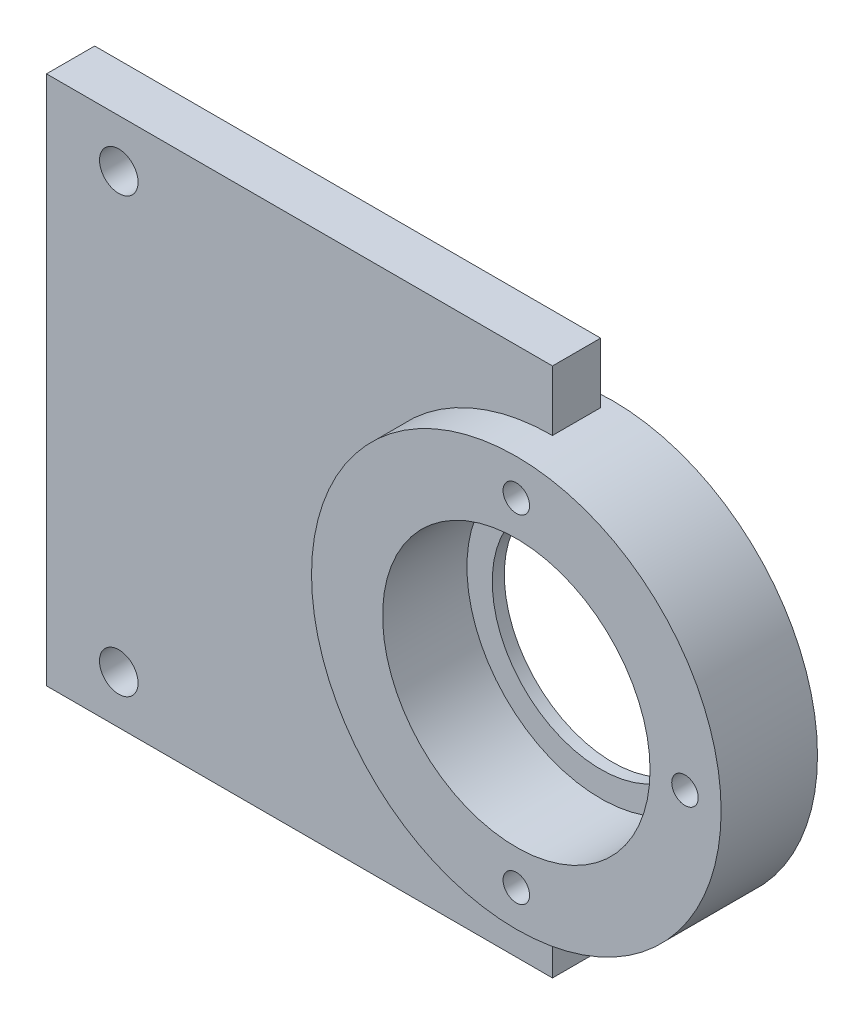
ISO-10303-21;
HEADER;
FILE_DESCRIPTION(('STEP AP214'),'2;1');
FILE_NAME('part.step','',(''),(''),'','','');
FILE_SCHEMA(('AUTOMOTIVE_DESIGN { 1 0 10303 214 1 1 1 1 }'));
ENDSEC;
DATA;
#1=APPLICATION_CONTEXT('core data for automotive mechanical design processes');
#2=APPLICATION_PROTOCOL_DEFINITION('international standard','automotive_design',2000,#1);
#3=PRODUCT_CONTEXT('',#1,'mechanical');
#4=PRODUCT('Part','Part','',(#3));
#5=PRODUCT_RELATED_PRODUCT_CATEGORY('part','',(#4));
#6=PRODUCT_DEFINITION_FORMATION('','',#4);
#7=PRODUCT_DEFINITION_CONTEXT('part definition',#1,'design');
#8=PRODUCT_DEFINITION('design','',#6,#7);
#9=PRODUCT_DEFINITION_SHAPE('','',#8);
#10=(LENGTH_UNIT() NAMED_UNIT(*) SI_UNIT(.MILLI.,.METRE.));
#11=(NAMED_UNIT(*) PLANE_ANGLE_UNIT() SI_UNIT($,.RADIAN.));
#12=(NAMED_UNIT(*) SI_UNIT($,.STERADIAN.) SOLID_ANGLE_UNIT());
#13=UNCERTAINTY_MEASURE_WITH_UNIT(LENGTH_MEASURE(1.E-05),#10,'distance_accuracy_value','');
#14=(GEOMETRIC_REPRESENTATION_CONTEXT(3) GLOBAL_UNCERTAINTY_ASSIGNED_CONTEXT((#13)) GLOBAL_UNIT_ASSIGNED_CONTEXT((#10,
#11,#12)) REPRESENTATION_CONTEXT('',''));
#15=CARTESIAN_POINT('',(0.,0.,0.));
#16=DIRECTION('',(0.,0.,1.));
#17=DIRECTION('',(1.,0.,0.));
#18=AXIS2_PLACEMENT_3D('',#15,#16,#17);
#19=CARTESIAN_POINT('',(0.,0.,0.));
#20=DIRECTION('',(0.,0.,1.));
#21=DIRECTION('',(1.,0.,0.));
#22=AXIS2_PLACEMENT_3D('',#19,#20,#21);
#23=PLANE('',#22);
#24=CARTESIAN_POINT('',(-36.,-18.,0.));
#25=DIRECTION('',(0.,0.,1.));
#26=DIRECTION('',(1.,0.,0.));
#27=AXIS2_PLACEMENT_3D('',#24,#25,#26);
#28=CIRCLE('',#27,1.6);
#29=CARTESIAN_POINT('',(-37.6,-18.,0.));
#30=VERTEX_POINT('',#29);
#31=EDGE_CURVE('E144',#30,#30,#28,.F.);
#32=ORIENTED_EDGE('',*,*,#31,.F.);
#33=EDGE_LOOP('',(#32));
#34=FACE_BOUND('',#33,.T.);
#35=CARTESIAN_POINT('',(-36.,18.,0.));
#36=DIRECTION('',(0.,0.,1.));
#37=DIRECTION('',(1.,0.,0.));
#38=AXIS2_PLACEMENT_3D('',#35,#36,#37);
#39=CIRCLE('',#38,1.6);
#40=CARTESIAN_POINT('',(-37.6,18.,0.));
#41=VERTEX_POINT('',#40);
#42=EDGE_CURVE('E137',#41,#41,#39,.F.);
#43=ORIENTED_EDGE('',*,*,#42,.F.);
#44=EDGE_LOOP('',(#43));
#45=FACE_BOUND('',#44,.T.);
#46=DIRECTION('',(0.,1.,0.));
#47=VECTOR('',#46,1.);
#48=CARTESIAN_POINT('',(0.,-22.,0.));
#49=LINE('',#48,#47);
#50=CARTESIAN_POINT('',(0.,17.,0.));
#51=VERTEX_POINT('',#50);
#52=CARTESIAN_POINT('',(0.,22.,0.));
#53=VERTEX_POINT('',#52);
#54=EDGE_CURVE('E98',#51,#53,#49,.T.);
#55=ORIENTED_EDGE('',*,*,#54,.F.);
#56=CARTESIAN_POINT('',(0.,0.,0.));
#57=DIRECTION('',(0.,0.,1.));
#58=DIRECTION('',(1.,0.,0.));
#59=AXIS2_PLACEMENT_3D('',#56,#57,#58);
#60=CIRCLE('',#59,17.);
#61=CARTESIAN_POINT('',(0.,-17.,0.));
#62=VERTEX_POINT('',#61);
#63=EDGE_CURVE('E64',#51,#62,#60,.T.);
#64=ORIENTED_EDGE('',*,*,#63,.T.);
#65=CARTESIAN_POINT('',(0.,-22.,0.));
#66=VERTEX_POINT('',#65);
#67=EDGE_CURVE('E94',#66,#62,#49,.T.);
#68=ORIENTED_EDGE('',*,*,#67,.F.);
#69=DIRECTION('',(1.,0.,0.));
#70=VECTOR('',#69,1.);
#71=CARTESIAN_POINT('',(-42.,-22.,0.));
#72=LINE('',#71,#70);
#73=CARTESIAN_POINT('',(-42.,-22.,0.));
#74=VERTEX_POINT('',#73);
#75=EDGE_CURVE('E114',#74,#66,#72,.T.);
#76=ORIENTED_EDGE('',*,*,#75,.F.);
#77=DIRECTION('',(0.,-1.,0.));
#78=VECTOR('',#77,1.);
#79=CARTESIAN_POINT('',(-42.,-22.,0.));
#80=LINE('',#79,#78);
#81=CARTESIAN_POINT('',(-42.,22.,0.));
#82=VERTEX_POINT('',#81);
#83=EDGE_CURVE('E97',#82,#74,#80,.T.);
#84=ORIENTED_EDGE('',*,*,#83,.F.);
#85=DIRECTION('',(-1.,0.,0.));
#86=VECTOR('',#85,1.);
#87=CARTESIAN_POINT('',(-42.,22.,0.));
#88=LINE('',#87,#86);
#89=EDGE_CURVE('E111',#53,#82,#88,.T.);
#90=ORIENTED_EDGE('',*,*,#89,.F.);
#91=EDGE_LOOP('',(#55,#64,#68,#76,#84,#90));
#92=FACE_BOUND('',#91,.T.);
#93=ADVANCED_FACE('F39',(#34,#45,#92),#23,.F.);
#94=CARTESIAN_POINT('',(0.,0.,7.));
#95=DIRECTION('',(0.,0.,-1.));
#96=DIRECTION('',(-1.,0.,0.));
#97=AXIS2_PLACEMENT_3D('',#94,#95,#96);
#98=CYLINDRICAL_SURFACE('',#97,17.);
#99=CARTESIAN_POINT('',(0.,0.,7.));
#100=DIRECTION('',(0.,0.,1.));
#101=DIRECTION('',(1.,0.,0.));
#102=AXIS2_PLACEMENT_3D('',#99,#100,#101);
#103=CIRCLE('',#102,17.);
#104=CARTESIAN_POINT('',(17.,0.,7.));
#105=VERTEX_POINT('',#104);
#106=EDGE_CURVE('E11',#105,#105,#103,.T.);
#107=ORIENTED_EDGE('',*,*,#106,.F.);
#108=EDGE_LOOP('',(#107));
#109=FACE_BOUND('',#108,.T.);
#110=DIRECTION('',(0.,0.,-1.));
#111=VECTOR('',#110,1.);
#112=CARTESIAN_POINT('',(0.,17.,7.));
#113=LINE('',#112,#111);
#114=CARTESIAN_POINT('',(0.,17.,4.));
#115=VERTEX_POINT('',#114);
#116=EDGE_CURVE('E102',#115,#51,#113,.T.);
#117=ORIENTED_EDGE('',*,*,#116,.F.);
#118=CARTESIAN_POINT('',(0.,0.,4.));
#119=DIRECTION('',(0.,0.,-1.));
#120=DIRECTION('',(-1.,0.,0.));
#121=AXIS2_PLACEMENT_3D('',#118,#119,#120);
#122=CIRCLE('',#121,17.);
#123=CARTESIAN_POINT('',(0.,-17.,4.));
#124=VERTEX_POINT('',#123);
#125=EDGE_CURVE('E57',#124,#115,#122,.T.);
#126=ORIENTED_EDGE('',*,*,#125,.F.);
#127=DIRECTION('',(0.,0.,-1.));
#128=VECTOR('',#127,1.);
#129=CARTESIAN_POINT('',(0.,-17.,7.));
#130=LINE('',#129,#128);
#131=EDGE_CURVE('E99',#62,#124,#130,.F.);
#132=ORIENTED_EDGE('',*,*,#131,.F.);
#133=ORIENTED_EDGE('',*,*,#63,.F.);
#134=EDGE_LOOP('',(#117,#126,#132,#133));
#135=FACE_BOUND('',#134,.T.);
#136=CARTESIAN_POINT('',(0.,0.,-1.));
#137=DIRECTION('',(0.,0.,1.));
#138=DIRECTION('',(1.,0.,0.));
#139=AXIS2_PLACEMENT_3D('',#136,#137,#138);
#140=CIRCLE('',#139,17.);
#141=CARTESIAN_POINT('',(17.,0.,-1.));
#142=VERTEX_POINT('',#141);
#143=EDGE_CURVE('E96',#142,#142,#140,.T.);
#144=ORIENTED_EDGE('',*,*,#143,.T.);
#145=EDGE_LOOP('',(#144));
#146=FACE_BOUND('',#145,.T.);
#147=ADVANCED_FACE('F41',(#109,#135,#146),#98,.T.);
#148=CARTESIAN_POINT('',(0.,0.,7.));
#149=DIRECTION('',(0.,0.,-1.));
#150=DIRECTION('',(-1.,0.,0.));
#151=AXIS2_PLACEMENT_3D('',#148,#149,#150);
#152=CYLINDRICAL_SURFACE('',#151,11.1);
#153=CARTESIAN_POINT('',(0.,0.,0.));
#154=DIRECTION('',(0.,0.,1.));
#155=DIRECTION('',(1.,0.,0.));
#156=AXIS2_PLACEMENT_3D('',#153,#154,#155);
#157=CIRCLE('',#156,11.1);
#158=CARTESIAN_POINT('',(11.1,0.,0.));
#159=VERTEX_POINT('',#158);
#160=EDGE_CURVE('E135',#159,#159,#157,.T.);
#161=ORIENTED_EDGE('',*,*,#160,.F.);
#162=EDGE_LOOP('',(#161));
#163=FACE_BOUND('',#162,.T.);
#164=CARTESIAN_POINT('',(0.,0.,7.));
#165=DIRECTION('',(0.,0.,1.));
#166=DIRECTION('',(1.,0.,0.));
#167=AXIS2_PLACEMENT_3D('',#164,#165,#166);
#168=CIRCLE('',#167,11.1);
#169=CARTESIAN_POINT('',(11.1,0.,7.));
#170=VERTEX_POINT('',#169);
#171=EDGE_CURVE('E48',#170,#170,#168,.T.);
#172=ORIENTED_EDGE('',*,*,#171,.T.);
#173=EDGE_LOOP('',(#172));
#174=FACE_BOUND('',#173,.T.);
#175=ADVANCED_FACE('F213',(#163,#174),#152,.F.);
#176=CARTESIAN_POINT('',(0.,0.,7.));
#177=DIRECTION('',(0.,0.,1.));
#178=DIRECTION('',(1.,0.,0.));
#179=AXIS2_PLACEMENT_3D('',#176,#177,#178);
#180=PLANE('',#179);
#181=CARTESIAN_POINT('',(14.,0.,7.));
#182=DIRECTION('',(0.,0.,1.));
#183=DIRECTION('',(1.,0.,0.));
#184=AXIS2_PLACEMENT_3D('',#181,#182,#183);
#185=CIRCLE('',#184,1.1);
#186=CARTESIAN_POINT('',(12.9,0.,7.));
#187=VERTEX_POINT('',#186);
#188=EDGE_CURVE('E150',#187,#187,#185,.T.);
#189=ORIENTED_EDGE('',*,*,#188,.F.);
#190=EDGE_LOOP('',(#189));
#191=FACE_BOUND('',#190,.T.);
#192=CARTESIAN_POINT('',(0.,-14.,7.));
#193=DIRECTION('',(0.,0.,1.));
#194=DIRECTION('',(1.,0.,0.));
#195=AXIS2_PLACEMENT_3D('',#192,#193,#194);
#196=CIRCLE('',#195,1.1);
#197=CARTESIAN_POINT('',(-1.1,-14.,7.));
#198=VERTEX_POINT('',#197);
#199=EDGE_CURVE('E269',#198,#198,#196,.T.);
#200=ORIENTED_EDGE('',*,*,#199,.F.);
#201=EDGE_LOOP('',(#200));
#202=FACE_BOUND('',#201,.T.);
#203=CARTESIAN_POINT('',(0.,14.,7.));
#204=DIRECTION('',(0.,0.,1.));
#205=DIRECTION('',(1.,0.,0.));
#206=AXIS2_PLACEMENT_3D('',#203,#204,#205);
#207=CIRCLE('',#206,1.1);
#208=CARTESIAN_POINT('',(-1.1,14.,7.));
#209=VERTEX_POINT('',#208);
#210=EDGE_CURVE('E275',#209,#209,#207,.T.);
#211=ORIENTED_EDGE('',*,*,#210,.F.);
#212=EDGE_LOOP('',(#211));
#213=FACE_BOUND('',#212,.T.);
#214=ORIENTED_EDGE('',*,*,#106,.T.);
#215=EDGE_LOOP('',(#214));
#216=FACE_BOUND('',#215,.T.);
#217=ORIENTED_EDGE('',*,*,#171,.F.);
#218=EDGE_LOOP('',(#217));
#219=FACE_BOUND('',#218,.T.);
#220=ADVANCED_FACE('F210',(#191,#202,#213,#216,#219),#180,.T.);
#221=CARTESIAN_POINT('',(0.,-22.,4.));
#222=DIRECTION('',(-1.,0.,0.));
#223=DIRECTION('',(0.,0.,1.));
#224=AXIS2_PLACEMENT_3D('',#221,#222,#223);
#225=PLANE('',#224);
#226=DIRECTION('',(0.,1.,0.));
#227=VECTOR('',#226,1.);
#228=CARTESIAN_POINT('',(0.,-22.,4.));
#229=LINE('',#228,#227);
#230=CARTESIAN_POINT('',(0.,22.,4.));
#231=VERTEX_POINT('',#230);
#232=EDGE_CURVE('E184',#115,#231,#229,.T.);
#233=ORIENTED_EDGE('',*,*,#232,.F.);
#234=ORIENTED_EDGE('',*,*,#116,.T.);
#235=ORIENTED_EDGE('',*,*,#54,.T.);
#236=DIRECTION('',(0.,0.,-1.));
#237=VECTOR('',#236,1.);
#238=CARTESIAN_POINT('',(0.,22.,4.));
#239=LINE('',#238,#237);
#240=EDGE_CURVE('E125',#231,#53,#239,.T.);
#241=ORIENTED_EDGE('',*,*,#240,.F.);
#242=EDGE_LOOP('',(#233,#234,#235,#241));
#243=FACE_BOUND('',#242,.T.);
#244=ADVANCED_FACE('F202',(#243),#225,.F.);
#245=ORIENTED_EDGE('',*,*,#67,.T.);
#246=ORIENTED_EDGE('',*,*,#131,.T.);
#247=CARTESIAN_POINT('',(0.,-22.,4.));
#248=VERTEX_POINT('',#247);
#249=EDGE_CURVE('E187',#248,#124,#229,.T.);
#250=ORIENTED_EDGE('',*,*,#249,.F.);
#251=DIRECTION('',(0.,0.,-1.));
#252=VECTOR('',#251,1.);
#253=CARTESIAN_POINT('',(0.,-22.,4.));
#254=LINE('',#253,#252);
#255=EDGE_CURVE('E109',#248,#66,#254,.T.);
#256=ORIENTED_EDGE('',*,*,#255,.T.);
#257=EDGE_LOOP('',(#245,#246,#250,#256));
#258=FACE_BOUND('',#257,.T.);
#259=ADVANCED_FACE('F108',(#258),#225,.F.);
#260=CARTESIAN_POINT('',(-42.,-22.,4.));
#261=DIRECTION('',(1.,0.,0.));
#262=DIRECTION('',(0.,0.,-1.));
#263=AXIS2_PLACEMENT_3D('',#260,#261,#262);
#264=PLANE('',#263);
#265=ORIENTED_EDGE('',*,*,#83,.T.);
#266=DIRECTION('',(0.,0.,-1.));
#267=VECTOR('',#266,1.);
#268=CARTESIAN_POINT('',(-42.,-22.,4.));
#269=LINE('',#268,#267);
#270=CARTESIAN_POINT('',(-42.,-22.,4.));
#271=VERTEX_POINT('',#270);
#272=EDGE_CURVE('E126',#271,#74,#269,.T.);
#273=ORIENTED_EDGE('',*,*,#272,.F.);
#274=DIRECTION('',(0.,-1.,0.));
#275=VECTOR('',#274,1.);
#276=CARTESIAN_POINT('',(-42.,-22.,4.));
#277=LINE('',#276,#275);
#278=CARTESIAN_POINT('',(-42.,22.,4.));
#279=VERTEX_POINT('',#278);
#280=EDGE_CURVE('E113',#279,#271,#277,.T.);
#281=ORIENTED_EDGE('',*,*,#280,.F.);
#282=DIRECTION('',(0.,0.,-1.));
#283=VECTOR('',#282,1.);
#284=CARTESIAN_POINT('',(-42.,22.,4.));
#285=LINE('',#284,#283);
#286=EDGE_CURVE('E118',#279,#82,#285,.T.);
#287=ORIENTED_EDGE('',*,*,#286,.T.);
#288=EDGE_LOOP('',(#265,#273,#281,#287));
#289=FACE_BOUND('',#288,.T.);
#290=ADVANCED_FACE('F199',(#289),#264,.F.);
#291=CARTESIAN_POINT('',(-42.,-22.,4.));
#292=DIRECTION('',(0.,1.,0.));
#293=DIRECTION('',(0.,0.,1.));
#294=AXIS2_PLACEMENT_3D('',#291,#292,#293);
#295=PLANE('',#294);
#296=ORIENTED_EDGE('',*,*,#75,.T.);
#297=ORIENTED_EDGE('',*,*,#255,.F.);
#298=DIRECTION('',(1.,0.,0.));
#299=VECTOR('',#298,1.);
#300=CARTESIAN_POINT('',(-42.,-22.,4.));
#301=LINE('',#300,#299);
#302=EDGE_CURVE('E182',#271,#248,#301,.T.);
#303=ORIENTED_EDGE('',*,*,#302,.F.);
#304=ORIENTED_EDGE('',*,*,#272,.T.);
#305=EDGE_LOOP('',(#296,#297,#303,#304));
#306=FACE_BOUND('',#305,.T.);
#307=ADVANCED_FACE('F195',(#306),#295,.F.);
#308=CARTESIAN_POINT('',(-42.,22.,4.));
#309=DIRECTION('',(0.,-1.,0.));
#310=DIRECTION('',(0.,0.,-1.));
#311=AXIS2_PLACEMENT_3D('',#308,#309,#310);
#312=PLANE('',#311);
#313=ORIENTED_EDGE('',*,*,#89,.T.);
#314=ORIENTED_EDGE('',*,*,#286,.F.);
#315=DIRECTION('',(-1.,0.,0.));
#316=VECTOR('',#315,1.);
#317=CARTESIAN_POINT('',(-42.,22.,4.));
#318=LINE('',#317,#316);
#319=EDGE_CURVE('E124',#231,#279,#318,.T.);
#320=ORIENTED_EDGE('',*,*,#319,.F.);
#321=ORIENTED_EDGE('',*,*,#240,.T.);
#322=EDGE_LOOP('',(#313,#314,#320,#321));
#323=FACE_BOUND('',#322,.T.);
#324=ADVANCED_FACE('F198',(#323),#312,.F.);
#325=CARTESIAN_POINT('',(0.,0.,4.));
#326=DIRECTION('',(0.,0.,-1.));
#327=DIRECTION('',(-1.,0.,0.));
#328=AXIS2_PLACEMENT_3D('',#325,#326,#327);
#329=PLANE('',#328);
#330=CARTESIAN_POINT('',(-36.,-18.,4.));
#331=DIRECTION('',(0.,0.,-1.));
#332=DIRECTION('',(-1.,0.,0.));
#333=AXIS2_PLACEMENT_3D('',#330,#331,#332);
#334=CIRCLE('',#333,1.6);
#335=CARTESIAN_POINT('',(-37.6,-18.,4.));
#336=VERTEX_POINT('',#335);
#337=EDGE_CURVE('E142',#336,#336,#334,.F.);
#338=ORIENTED_EDGE('',*,*,#337,.F.);
#339=EDGE_LOOP('',(#338));
#340=FACE_BOUND('',#339,.T.);
#341=CARTESIAN_POINT('',(-36.,18.,4.));
#342=DIRECTION('',(0.,0.,-1.));
#343=DIRECTION('',(-1.,0.,0.));
#344=AXIS2_PLACEMENT_3D('',#341,#342,#343);
#345=CIRCLE('',#344,1.6);
#346=CARTESIAN_POINT('',(-37.6,18.,4.));
#347=VERTEX_POINT('',#346);
#348=EDGE_CURVE('E140',#347,#347,#345,.F.);
#349=ORIENTED_EDGE('',*,*,#348,.F.);
#350=EDGE_LOOP('',(#349));
#351=FACE_BOUND('',#350,.T.);
#352=ORIENTED_EDGE('',*,*,#249,.T.);
#353=ORIENTED_EDGE('',*,*,#125,.T.);
#354=ORIENTED_EDGE('',*,*,#232,.T.);
#355=ORIENTED_EDGE('',*,*,#319,.T.);
#356=ORIENTED_EDGE('',*,*,#280,.T.);
#357=ORIENTED_EDGE('',*,*,#302,.T.);
#358=EDGE_LOOP('',(#352,#353,#354,#355,#356,#357));
#359=FACE_BOUND('',#358,.T.);
#360=ADVANCED_FACE('F205',(#340,#351,#359),#329,.F.);
#361=CARTESIAN_POINT('',(0.,0.,0.));
#362=DIRECTION('',(0.,0.,1.));
#363=DIRECTION('',(1.,0.,0.));
#364=AXIS2_PLACEMENT_3D('',#361,#362,#363);
#365=PLANE('',#364);
#366=ORIENTED_EDGE('',*,*,#160,.T.);
#367=EDGE_LOOP('',(#366));
#368=FACE_BOUND('',#367,.T.);
#369=CARTESIAN_POINT('',(0.,0.,0.));
#370=DIRECTION('',(0.,0.,1.));
#371=DIRECTION('',(1.,0.,0.));
#372=AXIS2_PLACEMENT_3D('',#369,#370,#371);
#373=CIRCLE('',#372,9.);
#374=CARTESIAN_POINT('',(9.,0.,0.));
#375=VERTEX_POINT('',#374);
#376=EDGE_CURVE('E173',#375,#375,#373,.T.);
#377=ORIENTED_EDGE('',*,*,#376,.F.);
#378=EDGE_LOOP('',(#377));
#379=FACE_BOUND('',#378,.T.);
#380=ADVANCED_FACE('F163',(#368,#379),#365,.T.);
#381=CARTESIAN_POINT('',(0.,0.,-1.));
#382=DIRECTION('',(0.,0.,1.));
#383=DIRECTION('',(1.,0.,0.));
#384=AXIS2_PLACEMENT_3D('',#381,#382,#383);
#385=PLANE('',#384);
#386=CARTESIAN_POINT('',(14.,0.,-1.));
#387=DIRECTION('',(0.,0.,1.));
#388=DIRECTION('',(1.,0.,0.));
#389=AXIS2_PLACEMENT_3D('',#386,#387,#388);
#390=CIRCLE('',#389,1.1);
#391=CARTESIAN_POINT('',(12.9,0.,-1.));
#392=VERTEX_POINT('',#391);
#393=EDGE_CURVE('E43',#392,#392,#390,.F.);
#394=ORIENTED_EDGE('',*,*,#393,.F.);
#395=EDGE_LOOP('',(#394));
#396=FACE_BOUND('',#395,.T.);
#397=CARTESIAN_POINT('',(0.,-14.,-1.));
#398=DIRECTION('',(0.,0.,1.));
#399=DIRECTION('',(1.,0.,0.));
#400=AXIS2_PLACEMENT_3D('',#397,#398,#399);
#401=CIRCLE('',#400,1.1);
#402=CARTESIAN_POINT('',(-1.1,-14.,-1.));
#403=VERTEX_POINT('',#402);
#404=EDGE_CURVE('E146',#403,#403,#401,.F.);
#405=ORIENTED_EDGE('',*,*,#404,.F.);
#406=EDGE_LOOP('',(#405));
#407=FACE_BOUND('',#406,.T.);
#408=CARTESIAN_POINT('',(0.,14.,-1.));
#409=DIRECTION('',(0.,0.,1.));
#410=DIRECTION('',(1.,0.,0.));
#411=AXIS2_PLACEMENT_3D('',#408,#409,#410);
#412=CIRCLE('',#411,1.1);
#413=CARTESIAN_POINT('',(-1.1,14.,-1.));
#414=VERTEX_POINT('',#413);
#415=EDGE_CURVE('E143',#414,#414,#412,.F.);
#416=ORIENTED_EDGE('',*,*,#415,.F.);
#417=EDGE_LOOP('',(#416));
#418=FACE_BOUND('',#417,.T.);
#419=ORIENTED_EDGE('',*,*,#143,.F.);
#420=EDGE_LOOP('',(#419));
#421=FACE_BOUND('',#420,.T.);
#422=CARTESIAN_POINT('',(0.,0.,-1.));
#423=DIRECTION('',(0.,0.,1.));
#424=DIRECTION('',(1.,0.,0.));
#425=AXIS2_PLACEMENT_3D('',#422,#423,#424);
#426=CIRCLE('',#425,9.);
#427=CARTESIAN_POINT('',(9.,0.,-1.));
#428=VERTEX_POINT('',#427);
#429=EDGE_CURVE('E171',#428,#428,#426,.T.);
#430=ORIENTED_EDGE('',*,*,#429,.T.);
#431=EDGE_LOOP('',(#430));
#432=FACE_BOUND('',#431,.T.);
#433=ADVANCED_FACE('F160',(#396,#407,#418,#421,#432),#385,.F.);
#434=CARTESIAN_POINT('',(0.,0.,0.));
#435=DIRECTION('',(0.,0.,-1.));
#436=DIRECTION('',(-1.,0.,0.));
#437=AXIS2_PLACEMENT_3D('',#434,#435,#436);
#438=CYLINDRICAL_SURFACE('',#437,9.);
#439=ORIENTED_EDGE('',*,*,#376,.T.);
#440=EDGE_LOOP('',(#439));
#441=FACE_BOUND('',#440,.T.);
#442=ORIENTED_EDGE('',*,*,#429,.F.);
#443=EDGE_LOOP('',(#442));
#444=FACE_BOUND('',#443,.T.);
#445=ADVANCED_FACE('F157',(#441,#444),#438,.F.);
#446=CARTESIAN_POINT('',(-36.,18.,7.));
#447=DIRECTION('',(0.,0.,-1.));
#448=DIRECTION('',(-1.,0.,0.));
#449=AXIS2_PLACEMENT_3D('',#446,#447,#448);
#450=CYLINDRICAL_SURFACE('',#449,1.6);
#451=CARTESIAN_POINT('',(-37.6,18.,4.));
#452=CARTESIAN_POINT('',(-37.6,18.,3.95833333333333));
#453=CARTESIAN_POINT('',(-37.6,18.,3.91666666666667));
#454=CARTESIAN_POINT('',(-37.6,18.,3.83333333333333));
#455=CARTESIAN_POINT('',(-37.6,18.,3.79166666666667));
#456=CARTESIAN_POINT('',(-37.6,18.,3.70833333333333));
#457=CARTESIAN_POINT('',(-37.6,18.,3.66666666666667));
#458=CARTESIAN_POINT('',(-37.6,18.,3.58333333333333));
#459=CARTESIAN_POINT('',(-37.6,18.,3.54166666666667));
#460=CARTESIAN_POINT('',(-37.6,18.,3.45833333333333));
#461=CARTESIAN_POINT('',(-37.6,18.,3.41666666666667));
#462=CARTESIAN_POINT('',(-37.6,18.,3.33333333333333));
#463=CARTESIAN_POINT('',(-37.6,18.,3.29166666666667));
#464=CARTESIAN_POINT('',(-37.6,18.,3.20833333333333));
#465=CARTESIAN_POINT('',(-37.6,18.,3.16666666666667));
#466=CARTESIAN_POINT('',(-37.6,18.,3.08333333333333));
#467=CARTESIAN_POINT('',(-37.6,18.,3.04166666666667));
#468=CARTESIAN_POINT('',(-37.6,18.,2.95833333333333));
#469=CARTESIAN_POINT('',(-37.6,18.,2.91666666666667));
#470=CARTESIAN_POINT('',(-37.6,18.,2.83333333333333));
#471=CARTESIAN_POINT('',(-37.6,18.,2.79166666666667));
#472=CARTESIAN_POINT('',(-37.6,18.,2.70833333333333));
#473=CARTESIAN_POINT('',(-37.6,18.,2.66666666666667));
#474=CARTESIAN_POINT('',(-37.6,18.,2.58333333333333));
#475=CARTESIAN_POINT('',(-37.6,18.,2.54166666666667));
#476=CARTESIAN_POINT('',(-37.6,18.,2.45833333333333));
#477=CARTESIAN_POINT('',(-37.6,18.,2.41666666666667));
#478=CARTESIAN_POINT('',(-37.6,18.,2.33333333333333));
#479=CARTESIAN_POINT('',(-37.6,18.,2.29166666666667));
#480=CARTESIAN_POINT('',(-37.6,18.,2.20833333333333));
#481=CARTESIAN_POINT('',(-37.6,18.,2.16666666666667));
#482=CARTESIAN_POINT('',(-37.6,18.,2.08333333333333));
#483=CARTESIAN_POINT('',(-37.6,18.,2.04166666666667));
#484=CARTESIAN_POINT('',(-37.6,18.,1.95833333333333));
#485=CARTESIAN_POINT('',(-37.6,18.,1.91666666666667));
#486=CARTESIAN_POINT('',(-37.6,18.,1.83333333333333));
#487=CARTESIAN_POINT('',(-37.6,18.,1.79166666666667));
#488=CARTESIAN_POINT('',(-37.6,18.,1.70833333333333));
#489=CARTESIAN_POINT('',(-37.6,18.,1.66666666666667));
#490=CARTESIAN_POINT('',(-37.6,18.,1.58333333333333));
#491=CARTESIAN_POINT('',(-37.6,18.,1.54166666666667));
#492=CARTESIAN_POINT('',(-37.6,18.,1.45833333333333));
#493=CARTESIAN_POINT('',(-37.6,18.,1.41666666666667));
#494=CARTESIAN_POINT('',(-37.6,18.,1.33333333333333));
#495=CARTESIAN_POINT('',(-37.6,18.,1.29166666666667));
#496=CARTESIAN_POINT('',(-37.6,18.,1.20833333333333));
#497=CARTESIAN_POINT('',(-37.6,18.,1.16666666666667));
#498=CARTESIAN_POINT('',(-37.6,18.,1.08333333333333));
#499=CARTESIAN_POINT('',(-37.6,18.,1.04166666666667));
#500=CARTESIAN_POINT('',(-37.6,18.,0.958333333333333));
#501=CARTESIAN_POINT('',(-37.6,18.,0.916666666666667));
#502=CARTESIAN_POINT('',(-37.6,18.,0.833333333333333));
#503=CARTESIAN_POINT('',(-37.6,18.,0.791666666666667));
#504=CARTESIAN_POINT('',(-37.6,18.,0.708333333333333));
#505=CARTESIAN_POINT('',(-37.6,18.,0.666666666666666));
#506=CARTESIAN_POINT('',(-37.6,18.,0.583333333333333));
#507=CARTESIAN_POINT('',(-37.6,18.,0.541666666666666));
#508=CARTESIAN_POINT('',(-37.6,18.,0.458333333333333));
#509=CARTESIAN_POINT('',(-37.6,18.,0.416666666666666));
#510=CARTESIAN_POINT('',(-37.6,18.,0.333333333333333));
#511=CARTESIAN_POINT('',(-37.6,18.,0.291666666666666));
#512=CARTESIAN_POINT('',(-37.6,18.,0.208333333333333));
#513=CARTESIAN_POINT('',(-37.6,18.,0.166666666666666));
#514=CARTESIAN_POINT('',(-37.6,18.,0.0833333333333325));
#515=CARTESIAN_POINT('',(-37.6,18.,0.0416666666666658));
#516=CARTESIAN_POINT('',(-37.6,18.,0.));
#517=B_SPLINE_CURVE_WITH_KNOTS('',3,(#451,#452,#453,#454,#455,#456,#457,#458,#459,#460,#461,
#462,#463,#464,#465,#466,#467,#468,#469,#470,#471,#472,#473,#474,#475,#476,#477,#478,#479,#480,
#481,#482,#483,#484,#485,#486,#487,#488,#489,#490,#491,#492,#493,#494,#495,#496,#497,#498,#499,
#500,#501,#502,#503,#504,#505,#506,#507,#508,#509,#510,#511,#512,#513,#514,#515,#516),
.UNSPECIFIED.,.F.,.F.,(4,2,2,2,2,2,2,2,2,2,2,2,2,2,2,2,2,2,2,2,2,2,2,2,2,2,2,2,2,2,2,2,4),(0.,
0.125,0.25,0.375,0.5,0.625,0.75,0.875,1.,1.125,1.25,1.375,1.5,1.625,1.75,1.875,2.,2.125,2.25,
2.375,2.5,2.625,2.75,2.875,3.,3.125,3.25,3.375,3.5,3.625,3.75,3.875,4.),.UNSPECIFIED.);
#518=EDGE_CURVE('BSEAM246',#347,#41,#517,.T.);
#519=ORIENTED_EDGE('',*,*,#348,.T.);
#520=ORIENTED_EDGE('',*,*,#42,.T.);
#521=ORIENTED_EDGE('',*,*,#518,.T.);
#522=ORIENTED_EDGE('',*,*,#518,.F.);
#523=EDGE_LOOP('',(#519,#521,#520,#522));
#524=FACE_BOUND('',#523,.T.);
#525=ADVANCED_FACE('F246',(#524),#450,.F.);
#526=CARTESIAN_POINT('',(-36.,-18.,7.));
#527=DIRECTION('',(0.,0.,-1.));
#528=DIRECTION('',(-1.,0.,0.));
#529=AXIS2_PLACEMENT_3D('',#526,#527,#528);
#530=CYLINDRICAL_SURFACE('',#529,1.6);
#531=CARTESIAN_POINT('',(-37.6,-18.,4.));
#532=CARTESIAN_POINT('',(-37.6,-18.,3.95833333333333));
#533=CARTESIAN_POINT('',(-37.6,-18.,3.91666666666667));
#534=CARTESIAN_POINT('',(-37.6,-18.,3.83333333333333));
#535=CARTESIAN_POINT('',(-37.6,-18.,3.79166666666667));
#536=CARTESIAN_POINT('',(-37.6,-18.,3.70833333333333));
#537=CARTESIAN_POINT('',(-37.6,-18.,3.66666666666667));
#538=CARTESIAN_POINT('',(-37.6,-18.,3.58333333333333));
#539=CARTESIAN_POINT('',(-37.6,-18.,3.54166666666667));
#540=CARTESIAN_POINT('',(-37.6,-18.,3.45833333333333));
#541=CARTESIAN_POINT('',(-37.6,-18.,3.41666666666667));
#542=CARTESIAN_POINT('',(-37.6,-18.,3.33333333333333));
#543=CARTESIAN_POINT('',(-37.6,-18.,3.29166666666667));
#544=CARTESIAN_POINT('',(-37.6,-18.,3.20833333333333));
#545=CARTESIAN_POINT('',(-37.6,-18.,3.16666666666667));
#546=CARTESIAN_POINT('',(-37.6,-18.,3.08333333333333));
#547=CARTESIAN_POINT('',(-37.6,-18.,3.04166666666667));
#548=CARTESIAN_POINT('',(-37.6,-18.,2.95833333333333));
#549=CARTESIAN_POINT('',(-37.6,-18.,2.91666666666667));
#550=CARTESIAN_POINT('',(-37.6,-18.,2.83333333333333));
#551=CARTESIAN_POINT('',(-37.6,-18.,2.79166666666667));
#552=CARTESIAN_POINT('',(-37.6,-18.,2.70833333333333));
#553=CARTESIAN_POINT('',(-37.6,-18.,2.66666666666667));
#554=CARTESIAN_POINT('',(-37.6,-18.,2.58333333333333));
#555=CARTESIAN_POINT('',(-37.6,-18.,2.54166666666667));
#556=CARTESIAN_POINT('',(-37.6,-18.,2.45833333333333));
#557=CARTESIAN_POINT('',(-37.6,-18.,2.41666666666667));
#558=CARTESIAN_POINT('',(-37.6,-18.,2.33333333333333));
#559=CARTESIAN_POINT('',(-37.6,-18.,2.29166666666667));
#560=CARTESIAN_POINT('',(-37.6,-18.,2.20833333333333));
#561=CARTESIAN_POINT('',(-37.6,-18.,2.16666666666667));
#562=CARTESIAN_POINT('',(-37.6,-18.,2.08333333333333));
#563=CARTESIAN_POINT('',(-37.6,-18.,2.04166666666667));
#564=CARTESIAN_POINT('',(-37.6,-18.,1.95833333333333));
#565=CARTESIAN_POINT('',(-37.6,-18.,1.91666666666667));
#566=CARTESIAN_POINT('',(-37.6,-18.,1.83333333333333));
#567=CARTESIAN_POINT('',(-37.6,-18.,1.79166666666667));
#568=CARTESIAN_POINT('',(-37.6,-18.,1.70833333333333));
#569=CARTESIAN_POINT('',(-37.6,-18.,1.66666666666667));
#570=CARTESIAN_POINT('',(-37.6,-18.,1.58333333333333));
#571=CARTESIAN_POINT('',(-37.6,-18.,1.54166666666667));
#572=CARTESIAN_POINT('',(-37.6,-18.,1.45833333333333));
#573=CARTESIAN_POINT('',(-37.6,-18.,1.41666666666667));
#574=CARTESIAN_POINT('',(-37.6,-18.,1.33333333333333));
#575=CARTESIAN_POINT('',(-37.6,-18.,1.29166666666667));
#576=CARTESIAN_POINT('',(-37.6,-18.,1.20833333333333));
#577=CARTESIAN_POINT('',(-37.6,-18.,1.16666666666667));
#578=CARTESIAN_POINT('',(-37.6,-18.,1.08333333333333));
#579=CARTESIAN_POINT('',(-37.6,-18.,1.04166666666667));
#580=CARTESIAN_POINT('',(-37.6,-18.,0.958333333333333));
#581=CARTESIAN_POINT('',(-37.6,-18.,0.916666666666667));
#582=CARTESIAN_POINT('',(-37.6,-18.,0.833333333333333));
#583=CARTESIAN_POINT('',(-37.6,-18.,0.791666666666667));
#584=CARTESIAN_POINT('',(-37.6,-18.,0.708333333333333));
#585=CARTESIAN_POINT('',(-37.6,-18.,0.666666666666666));
#586=CARTESIAN_POINT('',(-37.6,-18.,0.583333333333333));
#587=CARTESIAN_POINT('',(-37.6,-18.,0.541666666666666));
#588=CARTESIAN_POINT('',(-37.6,-18.,0.458333333333333));
#589=CARTESIAN_POINT('',(-37.6,-18.,0.416666666666666));
#590=CARTESIAN_POINT('',(-37.6,-18.,0.333333333333333));
#591=CARTESIAN_POINT('',(-37.6,-18.,0.291666666666666));
#592=CARTESIAN_POINT('',(-37.6,-18.,0.208333333333333));
#593=CARTESIAN_POINT('',(-37.6,-18.,0.166666666666666));
#594=CARTESIAN_POINT('',(-37.6,-18.,0.0833333333333325));
#595=CARTESIAN_POINT('',(-37.6,-18.,0.0416666666666658));
#596=CARTESIAN_POINT('',(-37.6,-18.,0.));
#597=B_SPLINE_CURVE_WITH_KNOTS('',3,(#531,#532,#533,#534,#535,#536,#537,#538,#539,#540,#541,
#542,#543,#544,#545,#546,#547,#548,#549,#550,#551,#552,#553,#554,#555,#556,#557,#558,#559,#560,
#561,#562,#563,#564,#565,#566,#567,#568,#569,#570,#571,#572,#573,#574,#575,#576,#577,#578,#579,
#580,#581,#582,#583,#584,#585,#586,#587,#588,#589,#590,#591,#592,#593,#594,#595,#596),
.UNSPECIFIED.,.F.,.F.,(4,2,2,2,2,2,2,2,2,2,2,2,2,2,2,2,2,2,2,2,2,2,2,2,2,2,2,2,2,2,2,2,4),(0.,
0.125,0.25,0.375,0.5,0.625,0.75,0.875,1.,1.125,1.25,1.375,1.5,1.625,1.75,1.875,2.,2.125,2.25,
2.375,2.5,2.625,2.75,2.875,3.,3.125,3.25,3.375,3.5,3.625,3.75,3.875,4.),.UNSPECIFIED.);
#598=EDGE_CURVE('BSEAM249',#336,#30,#597,.T.);
#599=ORIENTED_EDGE('',*,*,#337,.T.);
#600=ORIENTED_EDGE('',*,*,#31,.T.);
#601=ORIENTED_EDGE('',*,*,#598,.T.);
#602=ORIENTED_EDGE('',*,*,#598,.F.);
#603=EDGE_LOOP('',(#599,#601,#600,#602));
#604=FACE_BOUND('',#603,.T.);
#605=ADVANCED_FACE('F249',(#604),#530,.F.);
#606=CARTESIAN_POINT('',(0.,14.,7.));
#607=DIRECTION('',(0.,0.,-1.));
#608=DIRECTION('',(-1.,0.,0.));
#609=AXIS2_PLACEMENT_3D('',#606,#607,#608);
#610=CYLINDRICAL_SURFACE('',#609,1.1);
#611=CARTESIAN_POINT('',(-1.1,14.,7.));
#612=CARTESIAN_POINT('',(-1.1,14.,6.91666666666667));
#613=CARTESIAN_POINT('',(-1.1,14.,6.83333333333333));
#614=CARTESIAN_POINT('',(-1.1,14.,6.66666666666667));
#615=CARTESIAN_POINT('',(-1.1,14.,6.58333333333333));
#616=CARTESIAN_POINT('',(-1.1,14.,6.41666666666667));
#617=CARTESIAN_POINT('',(-1.1,14.,6.33333333333333));
#618=CARTESIAN_POINT('',(-1.1,14.,6.16666666666667));
#619=CARTESIAN_POINT('',(-1.1,14.,6.08333333333333));
#620=CARTESIAN_POINT('',(-1.1,14.,5.91666666666666));
#621=CARTESIAN_POINT('',(-1.1,14.,5.83333333333333));
#622=CARTESIAN_POINT('',(-1.1,14.,5.66666666666666));
#623=CARTESIAN_POINT('',(-1.1,14.,5.58333333333333));
#624=CARTESIAN_POINT('',(-1.1,14.,5.41666666666667));
#625=CARTESIAN_POINT('',(-1.1,14.,5.33333333333333));
#626=CARTESIAN_POINT('',(-1.1,14.,5.16666666666667));
#627=CARTESIAN_POINT('',(-1.1,14.,5.08333333333333));
#628=CARTESIAN_POINT('',(-1.1,14.,4.91666666666666));
#629=CARTESIAN_POINT('',(-1.1,14.,4.83333333333333));
#630=CARTESIAN_POINT('',(-1.1,14.,4.66666666666666));
#631=CARTESIAN_POINT('',(-1.1,14.,4.58333333333333));
#632=CARTESIAN_POINT('',(-1.1,14.,4.41666666666667));
#633=CARTESIAN_POINT('',(-1.1,14.,4.33333333333333));
#634=CARTESIAN_POINT('',(-1.1,14.,4.16666666666667));
#635=CARTESIAN_POINT('',(-1.1,14.,4.08333333333333));
#636=CARTESIAN_POINT('',(-1.1,14.,3.91666666666666));
#637=CARTESIAN_POINT('',(-1.1,14.,3.83333333333333));
#638=CARTESIAN_POINT('',(-1.1,14.,3.66666666666666));
#639=CARTESIAN_POINT('',(-1.1,14.,3.58333333333333));
#640=CARTESIAN_POINT('',(-1.1,14.,3.41666666666666));
#641=CARTESIAN_POINT('',(-1.1,14.,3.33333333333333));
#642=CARTESIAN_POINT('',(-1.1,14.,3.16666666666666));
#643=CARTESIAN_POINT('',(-1.1,14.,3.08333333333333));
#644=CARTESIAN_POINT('',(-1.1,14.,2.91666666666667));
#645=CARTESIAN_POINT('',(-1.1,14.,2.83333333333333));
#646=CARTESIAN_POINT('',(-1.1,14.,2.66666666666666));
#647=CARTESIAN_POINT('',(-1.1,14.,2.58333333333333));
#648=CARTESIAN_POINT('',(-1.1,14.,2.41666666666666));
#649=CARTESIAN_POINT('',(-1.1,14.,2.33333333333333));
#650=CARTESIAN_POINT('',(-1.1,14.,2.16666666666666));
#651=CARTESIAN_POINT('',(-1.1,14.,2.08333333333333));
#652=CARTESIAN_POINT('',(-1.1,14.,1.91666666666666));
#653=CARTESIAN_POINT('',(-1.1,14.,1.83333333333333));
#654=CARTESIAN_POINT('',(-1.1,14.,1.66666666666666));
#655=CARTESIAN_POINT('',(-1.1,14.,1.58333333333333));
#656=CARTESIAN_POINT('',(-1.1,14.,1.41666666666666));
#657=CARTESIAN_POINT('',(-1.1,14.,1.33333333333333));
#658=CARTESIAN_POINT('',(-1.1,14.,1.16666666666666));
#659=CARTESIAN_POINT('',(-1.1,14.,1.08333333333333));
#660=CARTESIAN_POINT('',(-1.1,14.,0.916666666666664));
#661=CARTESIAN_POINT('',(-1.1,14.,0.833333333333331));
#662=CARTESIAN_POINT('',(-1.1,14.,0.666666666666664));
#663=CARTESIAN_POINT('',(-1.1,14.,0.58333333333333));
#664=CARTESIAN_POINT('',(-1.1,14.,0.416666666666664));
#665=CARTESIAN_POINT('',(-1.1,14.,0.33333333333333));
#666=CARTESIAN_POINT('',(-1.1,14.,0.166666666666664));
#667=CARTESIAN_POINT('',(-1.1,14.,0.0833333333333305));
#668=CARTESIAN_POINT('',(-1.1,14.,-0.083333333333336));
#669=CARTESIAN_POINT('',(-1.1,14.,-0.166666666666669));
#670=CARTESIAN_POINT('',(-1.1,14.,-0.333333333333336));
#671=CARTESIAN_POINT('',(-1.1,14.,-0.41666666666667));
#672=CARTESIAN_POINT('',(-1.1,14.,-0.583333333333336));
#673=CARTESIAN_POINT('',(-1.1,14.,-0.66666666666667));
#674=CARTESIAN_POINT('',(-1.1,14.,-0.833333333333336));
#675=CARTESIAN_POINT('',(-1.1,14.,-0.91666666666667));
#676=CARTESIAN_POINT('',(-1.1,14.,-1.));
#677=B_SPLINE_CURVE_WITH_KNOTS('',3,(#611,#612,#613,#614,#615,#616,#617,#618,#619,#620,#621,
#622,#623,#624,#625,#626,#627,#628,#629,#630,#631,#632,#633,#634,#635,#636,#637,#638,#639,#640,
#641,#642,#643,#644,#645,#646,#647,#648,#649,#650,#651,#652,#653,#654,#655,#656,#657,#658,#659,
#660,#661,#662,#663,#664,#665,#666,#667,#668,#669,#670,#671,#672,#673,#674,#675,#676),
.UNSPECIFIED.,.F.,.F.,(4,2,2,2,2,2,2,2,2,2,2,2,2,2,2,2,2,2,2,2,2,2,2,2,2,2,2,2,2,2,2,2,4),(0.,
0.25,0.5,0.750000000000001,1.,1.25,1.5,1.75,2.,2.25,2.5,2.75,3.,3.25,3.5,3.75,4.,4.25,4.5,4.75,
5.,5.25,5.5,5.75,6.,6.25,6.5,6.75,7.,7.25,7.5,7.75,8.),.UNSPECIFIED.);
#678=EDGE_CURVE('BSEAM251',#209,#414,#677,.T.);
#679=ORIENTED_EDGE('',*,*,#210,.T.);
#680=ORIENTED_EDGE('',*,*,#415,.T.);
#681=ORIENTED_EDGE('',*,*,#678,.T.);
#682=ORIENTED_EDGE('',*,*,#678,.F.);
#683=EDGE_LOOP('',(#679,#681,#680,#682));
#684=FACE_BOUND('',#683,.T.);
#685=ADVANCED_FACE('F251',(#684),#610,.F.);
#686=CARTESIAN_POINT('',(0.,-14.,7.));
#687=DIRECTION('',(0.,0.,-1.));
#688=DIRECTION('',(-1.,0.,0.));
#689=AXIS2_PLACEMENT_3D('',#686,#687,#688);
#690=CYLINDRICAL_SURFACE('',#689,1.1);
#691=CARTESIAN_POINT('',(-1.1,-14.,7.));
#692=CARTESIAN_POINT('',(-1.1,-14.,6.91666666666667));
#693=CARTESIAN_POINT('',(-1.1,-14.,6.83333333333333));
#694=CARTESIAN_POINT('',(-1.1,-14.,6.66666666666667));
#695=CARTESIAN_POINT('',(-1.1,-14.,6.58333333333333));
#696=CARTESIAN_POINT('',(-1.1,-14.,6.41666666666667));
#697=CARTESIAN_POINT('',(-1.1,-14.,6.33333333333333));
#698=CARTESIAN_POINT('',(-1.1,-14.,6.16666666666667));
#699=CARTESIAN_POINT('',(-1.1,-14.,6.08333333333333));
#700=CARTESIAN_POINT('',(-1.1,-14.,5.91666666666666));
#701=CARTESIAN_POINT('',(-1.1,-14.,5.83333333333333));
#702=CARTESIAN_POINT('',(-1.1,-14.,5.66666666666666));
#703=CARTESIAN_POINT('',(-1.1,-14.,5.58333333333333));
#704=CARTESIAN_POINT('',(-1.1,-14.,5.41666666666667));
#705=CARTESIAN_POINT('',(-1.1,-14.,5.33333333333333));
#706=CARTESIAN_POINT('',(-1.1,-14.,5.16666666666667));
#707=CARTESIAN_POINT('',(-1.1,-14.,5.08333333333333));
#708=CARTESIAN_POINT('',(-1.1,-14.,4.91666666666666));
#709=CARTESIAN_POINT('',(-1.1,-14.,4.83333333333333));
#710=CARTESIAN_POINT('',(-1.1,-14.,4.66666666666666));
#711=CARTESIAN_POINT('',(-1.1,-14.,4.58333333333333));
#712=CARTESIAN_POINT('',(-1.1,-14.,4.41666666666667));
#713=CARTESIAN_POINT('',(-1.1,-14.,4.33333333333333));
#714=CARTESIAN_POINT('',(-1.1,-14.,4.16666666666667));
#715=CARTESIAN_POINT('',(-1.1,-14.,4.08333333333333));
#716=CARTESIAN_POINT('',(-1.1,-14.,3.91666666666666));
#717=CARTESIAN_POINT('',(-1.1,-14.,3.83333333333333));
#718=CARTESIAN_POINT('',(-1.1,-14.,3.66666666666666));
#719=CARTESIAN_POINT('',(-1.1,-14.,3.58333333333333));
#720=CARTESIAN_POINT('',(-1.1,-14.,3.41666666666666));
#721=CARTESIAN_POINT('',(-1.1,-14.,3.33333333333333));
#722=CARTESIAN_POINT('',(-1.1,-14.,3.16666666666666));
#723=CARTESIAN_POINT('',(-1.1,-14.,3.08333333333333));
#724=CARTESIAN_POINT('',(-1.1,-14.,2.91666666666667));
#725=CARTESIAN_POINT('',(-1.1,-14.,2.83333333333333));
#726=CARTESIAN_POINT('',(-1.1,-14.,2.66666666666666));
#727=CARTESIAN_POINT('',(-1.1,-14.,2.58333333333333));
#728=CARTESIAN_POINT('',(-1.1,-14.,2.41666666666666));
#729=CARTESIAN_POINT('',(-1.1,-14.,2.33333333333333));
#730=CARTESIAN_POINT('',(-1.1,-14.,2.16666666666666));
#731=CARTESIAN_POINT('',(-1.1,-14.,2.08333333333333));
#732=CARTESIAN_POINT('',(-1.1,-14.,1.91666666666666));
#733=CARTESIAN_POINT('',(-1.1,-14.,1.83333333333333));
#734=CARTESIAN_POINT('',(-1.1,-14.,1.66666666666666));
#735=CARTESIAN_POINT('',(-1.1,-14.,1.58333333333333));
#736=CARTESIAN_POINT('',(-1.1,-14.,1.41666666666666));
#737=CARTESIAN_POINT('',(-1.1,-14.,1.33333333333333));
#738=CARTESIAN_POINT('',(-1.1,-14.,1.16666666666666));
#739=CARTESIAN_POINT('',(-1.1,-14.,1.08333333333333));
#740=CARTESIAN_POINT('',(-1.1,-14.,0.916666666666664));
#741=CARTESIAN_POINT('',(-1.1,-14.,0.833333333333331));
#742=CARTESIAN_POINT('',(-1.1,-14.,0.666666666666664));
#743=CARTESIAN_POINT('',(-1.1,-14.,0.58333333333333));
#744=CARTESIAN_POINT('',(-1.1,-14.,0.416666666666664));
#745=CARTESIAN_POINT('',(-1.1,-14.,0.33333333333333));
#746=CARTESIAN_POINT('',(-1.1,-14.,0.166666666666664));
#747=CARTESIAN_POINT('',(-1.1,-14.,0.0833333333333305));
#748=CARTESIAN_POINT('',(-1.1,-14.,-0.083333333333336));
#749=CARTESIAN_POINT('',(-1.1,-14.,-0.166666666666669));
#750=CARTESIAN_POINT('',(-1.1,-14.,-0.333333333333336));
#751=CARTESIAN_POINT('',(-1.1,-14.,-0.41666666666667));
#752=CARTESIAN_POINT('',(-1.1,-14.,-0.583333333333336));
#753=CARTESIAN_POINT('',(-1.1,-14.,-0.66666666666667));
#754=CARTESIAN_POINT('',(-1.1,-14.,-0.833333333333336));
#755=CARTESIAN_POINT('',(-1.1,-14.,-0.91666666666667));
#756=CARTESIAN_POINT('',(-1.1,-14.,-1.));
#757=B_SPLINE_CURVE_WITH_KNOTS('',3,(#691,#692,#693,#694,#695,#696,#697,#698,#699,#700,#701,
#702,#703,#704,#705,#706,#707,#708,#709,#710,#711,#712,#713,#714,#715,#716,#717,#718,#719,#720,
#721,#722,#723,#724,#725,#726,#727,#728,#729,#730,#731,#732,#733,#734,#735,#736,#737,#738,#739,
#740,#741,#742,#743,#744,#745,#746,#747,#748,#749,#750,#751,#752,#753,#754,#755,#756),
.UNSPECIFIED.,.F.,.F.,(4,2,2,2,2,2,2,2,2,2,2,2,2,2,2,2,2,2,2,2,2,2,2,2,2,2,2,2,2,2,2,2,4),(0.,
0.25,0.5,0.750000000000001,1.,1.25,1.5,1.75,2.,2.25,2.5,2.75,3.,3.25,3.5,3.75,4.,4.25,4.5,4.75,
5.,5.25,5.5,5.75,6.,6.25,6.5,6.75,7.,7.25,7.5,7.75,8.),.UNSPECIFIED.);
#758=EDGE_CURVE('BSEAM260',#198,#403,#757,.T.);
#759=ORIENTED_EDGE('',*,*,#199,.T.);
#760=ORIENTED_EDGE('',*,*,#404,.T.);
#761=ORIENTED_EDGE('',*,*,#758,.T.);
#762=ORIENTED_EDGE('',*,*,#758,.F.);
#763=EDGE_LOOP('',(#759,#761,#760,#762));
#764=FACE_BOUND('',#763,.T.);
#765=ADVANCED_FACE('F260',(#764),#690,.F.);
#766=CARTESIAN_POINT('',(14.,0.,7.));
#767=DIRECTION('',(0.,0.,-1.));
#768=DIRECTION('',(-1.,0.,0.));
#769=AXIS2_PLACEMENT_3D('',#766,#767,#768);
#770=CYLINDRICAL_SURFACE('',#769,1.1);
#771=CARTESIAN_POINT('',(12.9,0.,7.));
#772=CARTESIAN_POINT('',(12.9,0.,6.91666666666667));
#773=CARTESIAN_POINT('',(12.9,0.,6.83333333333333));
#774=CARTESIAN_POINT('',(12.9,0.,6.66666666666667));
#775=CARTESIAN_POINT('',(12.9,0.,6.58333333333333));
#776=CARTESIAN_POINT('',(12.9,0.,6.41666666666667));
#777=CARTESIAN_POINT('',(12.9,0.,6.33333333333333));
#778=CARTESIAN_POINT('',(12.9,0.,6.16666666666667));
#779=CARTESIAN_POINT('',(12.9,0.,6.08333333333333));
#780=CARTESIAN_POINT('',(12.9,0.,5.91666666666666));
#781=CARTESIAN_POINT('',(12.9,0.,5.83333333333333));
#782=CARTESIAN_POINT('',(12.9,0.,5.66666666666666));
#783=CARTESIAN_POINT('',(12.9,0.,5.58333333333333));
#784=CARTESIAN_POINT('',(12.9,0.,5.41666666666667));
#785=CARTESIAN_POINT('',(12.9,0.,5.33333333333333));
#786=CARTESIAN_POINT('',(12.9,0.,5.16666666666667));
#787=CARTESIAN_POINT('',(12.9,0.,5.08333333333333));
#788=CARTESIAN_POINT('',(12.9,0.,4.91666666666666));
#789=CARTESIAN_POINT('',(12.9,0.,4.83333333333333));
#790=CARTESIAN_POINT('',(12.9,0.,4.66666666666666));
#791=CARTESIAN_POINT('',(12.9,0.,4.58333333333333));
#792=CARTESIAN_POINT('',(12.9,0.,4.41666666666667));
#793=CARTESIAN_POINT('',(12.9,0.,4.33333333333333));
#794=CARTESIAN_POINT('',(12.9,0.,4.16666666666667));
#795=CARTESIAN_POINT('',(12.9,0.,4.08333333333333));
#796=CARTESIAN_POINT('',(12.9,0.,3.91666666666666));
#797=CARTESIAN_POINT('',(12.9,0.,3.83333333333333));
#798=CARTESIAN_POINT('',(12.9,0.,3.66666666666666));
#799=CARTESIAN_POINT('',(12.9,0.,3.58333333333333));
#800=CARTESIAN_POINT('',(12.9,0.,3.41666666666666));
#801=CARTESIAN_POINT('',(12.9,0.,3.33333333333333));
#802=CARTESIAN_POINT('',(12.9,0.,3.16666666666666));
#803=CARTESIAN_POINT('',(12.9,0.,3.08333333333333));
#804=CARTESIAN_POINT('',(12.9,0.,2.91666666666667));
#805=CARTESIAN_POINT('',(12.9,0.,2.83333333333333));
#806=CARTESIAN_POINT('',(12.9,0.,2.66666666666666));
#807=CARTESIAN_POINT('',(12.9,0.,2.58333333333333));
#808=CARTESIAN_POINT('',(12.9,0.,2.41666666666666));
#809=CARTESIAN_POINT('',(12.9,0.,2.33333333333333));
#810=CARTESIAN_POINT('',(12.9,0.,2.16666666666666));
#811=CARTESIAN_POINT('',(12.9,0.,2.08333333333333));
#812=CARTESIAN_POINT('',(12.9,0.,1.91666666666666));
#813=CARTESIAN_POINT('',(12.9,0.,1.83333333333333));
#814=CARTESIAN_POINT('',(12.9,0.,1.66666666666666));
#815=CARTESIAN_POINT('',(12.9,0.,1.58333333333333));
#816=CARTESIAN_POINT('',(12.9,0.,1.41666666666666));
#817=CARTESIAN_POINT('',(12.9,0.,1.33333333333333));
#818=CARTESIAN_POINT('',(12.9,0.,1.16666666666666));
#819=CARTESIAN_POINT('',(12.9,0.,1.08333333333333));
#820=CARTESIAN_POINT('',(12.9,0.,0.916666666666664));
#821=CARTESIAN_POINT('',(12.9,0.,0.833333333333331));
#822=CARTESIAN_POINT('',(12.9,0.,0.666666666666664));
#823=CARTESIAN_POINT('',(12.9,0.,0.58333333333333));
#824=CARTESIAN_POINT('',(12.9,0.,0.416666666666664));
#825=CARTESIAN_POINT('',(12.9,0.,0.33333333333333));
#826=CARTESIAN_POINT('',(12.9,0.,0.166666666666664));
#827=CARTESIAN_POINT('',(12.9,0.,0.0833333333333305));
#828=CARTESIAN_POINT('',(12.9,0.,-0.083333333333336));
#829=CARTESIAN_POINT('',(12.9,0.,-0.166666666666669));
#830=CARTESIAN_POINT('',(12.9,0.,-0.333333333333336));
#831=CARTESIAN_POINT('',(12.9,0.,-0.41666666666667));
#832=CARTESIAN_POINT('',(12.9,0.,-0.583333333333336));
#833=CARTESIAN_POINT('',(12.9,0.,-0.66666666666667));
#834=CARTESIAN_POINT('',(12.9,0.,-0.833333333333336));
#835=CARTESIAN_POINT('',(12.9,0.,-0.91666666666667));
#836=CARTESIAN_POINT('',(12.9,0.,-1.));
#837=B_SPLINE_CURVE_WITH_KNOTS('',3,(#771,#772,#773,#774,#775,#776,#777,#778,#779,#780,#781,
#782,#783,#784,#785,#786,#787,#788,#789,#790,#791,#792,#793,#794,#795,#796,#797,#798,#799,#800,
#801,#802,#803,#804,#805,#806,#807,#808,#809,#810,#811,#812,#813,#814,#815,#816,#817,#818,#819,
#820,#821,#822,#823,#824,#825,#826,#827,#828,#829,#830,#831,#832,#833,#834,#835,#836),
.UNSPECIFIED.,.F.,.F.,(4,2,2,2,2,2,2,2,2,2,2,2,2,2,2,2,2,2,2,2,2,2,2,2,2,2,2,2,2,2,2,2,4),(0.,
0.25,0.5,0.750000000000001,1.,1.25,1.5,1.75,2.,2.25,2.5,2.75,3.,3.25,3.5,3.75,4.,4.25,4.5,4.75,
5.,5.25,5.5,5.75,6.,6.25,6.5,6.75,7.,7.25,7.5,7.75,8.),.UNSPECIFIED.);
#838=EDGE_CURVE('BSEAM154',#187,#392,#837,.T.);
#839=ORIENTED_EDGE('',*,*,#188,.T.);
#840=ORIENTED_EDGE('',*,*,#393,.T.);
#841=ORIENTED_EDGE('',*,*,#838,.T.);
#842=ORIENTED_EDGE('',*,*,#838,.F.);
#843=EDGE_LOOP('',(#839,#841,#840,#842));
#844=FACE_BOUND('',#843,.T.);
#845=ADVANCED_FACE('F154',(#844),#770,.F.);
#846=CLOSED_SHELL('',(#93,#147,#175,#220,#244,#259,#290,#307,#324,#360,#380,#433,#445,#525,#605,
#685,#765,#845));
#847=MANIFOLD_SOLID_BREP('B2',#846);
#848=ADVANCED_BREP_SHAPE_REPRESENTATION('',(#18,#847),#14);
#849=SHAPE_DEFINITION_REPRESENTATION(#9,#848);
ENDSEC;
END-ISO-10303-21;
